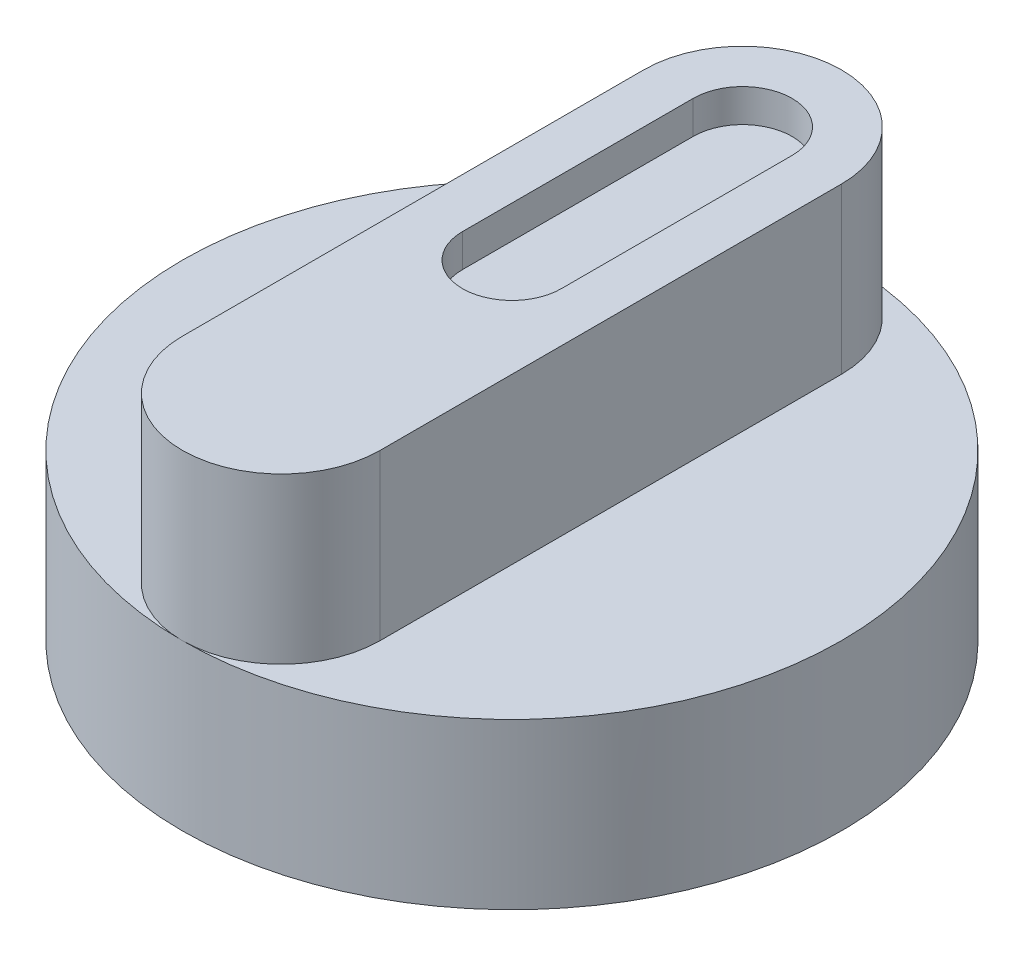
ISO-10303-21;
HEADER;
FILE_DESCRIPTION(('STEP AP214'),'2;1');
FILE_NAME('part.step','',(''),(''),'','','');
FILE_SCHEMA(('AUTOMOTIVE_DESIGN { 1 0 10303 214 1 1 1 1 }'));
ENDSEC;
DATA;
#1=APPLICATION_CONTEXT('core data for automotive mechanical design processes');
#2=APPLICATION_PROTOCOL_DEFINITION('international standard','automotive_design',2000,#1);
#3=PRODUCT_CONTEXT('',#1,'mechanical');
#4=PRODUCT('Part','Part','',(#3));
#5=PRODUCT_RELATED_PRODUCT_CATEGORY('part','',(#4));
#6=PRODUCT_DEFINITION_FORMATION('','',#4);
#7=PRODUCT_DEFINITION_CONTEXT('part definition',#1,'design');
#8=PRODUCT_DEFINITION('design','',#6,#7);
#9=PRODUCT_DEFINITION_SHAPE('','',#8);
#10=(LENGTH_UNIT() NAMED_UNIT(*) SI_UNIT(.MILLI.,.METRE.));
#11=(NAMED_UNIT(*) PLANE_ANGLE_UNIT() SI_UNIT($,.RADIAN.));
#12=(NAMED_UNIT(*) SI_UNIT($,.STERADIAN.) SOLID_ANGLE_UNIT());
#13=UNCERTAINTY_MEASURE_WITH_UNIT(LENGTH_MEASURE(1.E-05),#10,'distance_accuracy_value','');
#14=(GEOMETRIC_REPRESENTATION_CONTEXT(3) GLOBAL_UNCERTAINTY_ASSIGNED_CONTEXT((#13)) GLOBAL_UNIT_ASSIGNED_CONTEXT((#10,
#11,#12)) REPRESENTATION_CONTEXT('',''));
#15=CARTESIAN_POINT('',(0.,0.,0.));
#16=DIRECTION('',(0.,0.,1.));
#17=DIRECTION('',(1.,0.,0.));
#18=AXIS2_PLACEMENT_3D('',#15,#16,#17);
#19=CARTESIAN_POINT('',(0.,10.,0.));
#20=DIRECTION('',(0.,1.,0.));
#21=DIRECTION('',(0.,0.,1.));
#22=AXIS2_PLACEMENT_3D('',#19,#20,#21);
#23=PLANE('',#22);
#24=DIRECTION('',(0.,0.,-1.));
#25=VECTOR('',#24,1.);
#26=CARTESIAN_POINT('',(6.,10.,-14.));
#27=LINE('',#26,#25);
#28=CARTESIAN_POINT('',(6.,10.,14.));
#29=VERTEX_POINT('',#28);
#30=CARTESIAN_POINT('',(6.,10.,-14.));
#31=VERTEX_POINT('',#30);
#32=EDGE_CURVE('E61',#29,#31,#27,.T.);
#33=ORIENTED_EDGE('',*,*,#32,.F.);
#34=CARTESIAN_POINT('',(0.,10.,14.));
#35=DIRECTION('',(0.,1.,0.));
#36=DIRECTION('',(0.,0.,1.));
#37=AXIS2_PLACEMENT_3D('',#34,#35,#36);
#38=CIRCLE('',#37,6.);
#39=CARTESIAN_POINT('',(0.,10.,20.));
#40=VERTEX_POINT('',#39);
#41=EDGE_CURVE('E11',#40,#29,#38,.T.);
#42=ORIENTED_EDGE('',*,*,#41,.F.);
#43=CARTESIAN_POINT('',(0.,10.,0.));
#44=DIRECTION('',(0.,1.,0.));
#45=DIRECTION('',(0.,0.,1.));
#46=AXIS2_PLACEMENT_3D('',#43,#44,#45);
#47=CIRCLE('',#46,20.);
#48=CARTESIAN_POINT('',(0.,10.,-20.));
#49=VERTEX_POINT('',#48);
#50=EDGE_CURVE('E174',#40,#49,#47,.T.);
#51=ORIENTED_EDGE('',*,*,#50,.T.);
#52=CARTESIAN_POINT('',(0.,10.,-14.));
#53=DIRECTION('',(0.,1.,0.));
#54=DIRECTION('',(0.,0.,1.));
#55=AXIS2_PLACEMENT_3D('',#52,#53,#54);
#56=CIRCLE('',#55,6.);
#57=EDGE_CURVE('E143',#31,#49,#56,.T.);
#58=ORIENTED_EDGE('',*,*,#57,.F.);
#59=EDGE_LOOP('',(#33,#42,#51,#58));
#60=FACE_BOUND('',#59,.T.);
#61=ADVANCED_FACE('F35',(#60),#23,.T.);
#62=CARTESIAN_POINT('',(0.,10.,0.));
#63=DIRECTION('',(0.,-1.,0.));
#64=DIRECTION('',(0.,0.,-1.));
#65=AXIS2_PLACEMENT_3D('',#62,#63,#64);
#66=CYLINDRICAL_SURFACE('',#65,20.);
#67=ORIENTED_EDGE('',*,*,#50,.F.);
#68=EDGE_CURVE('E176',#49,#40,#47,.T.);
#69=ORIENTED_EDGE('',*,*,#68,.F.);
#70=EDGE_LOOP('',(#67,#69));
#71=FACE_BOUND('',#70,.T.);
#72=CARTESIAN_POINT('',(0.,0.,0.));
#73=DIRECTION('',(0.,1.,0.));
#74=DIRECTION('',(0.,0.,1.));
#75=AXIS2_PLACEMENT_3D('',#72,#73,#74);
#76=CIRCLE('',#75,20.);
#77=CARTESIAN_POINT('',(0.,0.,20.));
#78=VERTEX_POINT('',#77);
#79=EDGE_CURVE('E39',#78,#78,#76,.T.);
#80=ORIENTED_EDGE('',*,*,#79,.T.);
#81=EDGE_LOOP('',(#80));
#82=FACE_BOUND('',#81,.T.);
#83=ADVANCED_FACE('F37',(#71,#82),#66,.T.);
#84=CARTESIAN_POINT('',(-6.00000000000001,10.,-14.));
#85=VERTEX_POINT('',#84);
#86=EDGE_CURVE('E44',#49,#85,#56,.T.);
#87=ORIENTED_EDGE('',*,*,#86,.F.);
#88=ORIENTED_EDGE('',*,*,#68,.T.);
#89=CARTESIAN_POINT('',(-6.,10.,14.));
#90=VERTEX_POINT('',#89);
#91=EDGE_CURVE('E46',#90,#40,#38,.T.);
#92=ORIENTED_EDGE('',*,*,#91,.F.);
#93=DIRECTION('',(0.,0.,1.));
#94=VECTOR('',#93,1.);
#95=CARTESIAN_POINT('',(-6.00000000000001,10.,-14.));
#96=LINE('',#95,#94);
#97=EDGE_CURVE('E159',#85,#90,#96,.T.);
#98=ORIENTED_EDGE('',*,*,#97,.F.);
#99=EDGE_LOOP('',(#87,#88,#92,#98));
#100=FACE_BOUND('',#99,.T.);
#101=ADVANCED_FACE('F189',(#100),#23,.T.);
#102=CARTESIAN_POINT('',(0.,0.,0.));
#103=DIRECTION('',(0.,1.,0.));
#104=DIRECTION('',(0.,0.,1.));
#105=AXIS2_PLACEMENT_3D('',#102,#103,#104);
#106=PLANE('',#105);
#107=ORIENTED_EDGE('',*,*,#79,.F.);
#108=EDGE_LOOP('',(#107));
#109=FACE_BOUND('',#108,.T.);
#110=ADVANCED_FACE('F186',(#109),#106,.F.);
#111=CARTESIAN_POINT('',(0.,20.,-14.));
#112=DIRECTION('',(0.,-1.,0.));
#113=DIRECTION('',(0.,0.,-1.));
#114=AXIS2_PLACEMENT_3D('',#111,#112,#113);
#115=CYLINDRICAL_SURFACE('',#114,6.);
#116=ORIENTED_EDGE('',*,*,#57,.T.);
#117=ORIENTED_EDGE('',*,*,#86,.T.);
#118=DIRECTION('',(0.,-1.,0.));
#119=VECTOR('',#118,1.);
#120=CARTESIAN_POINT('',(-6.00000000000001,20.,-14.));
#121=LINE('',#120,#119);
#122=CARTESIAN_POINT('',(-6.00000000000001,20.,-14.));
#123=VERTEX_POINT('',#122);
#124=EDGE_CURVE('E172',#123,#85,#121,.T.);
#125=ORIENTED_EDGE('',*,*,#124,.F.);
#126=CARTESIAN_POINT('',(0.,20.,-14.));
#127=DIRECTION('',(0.,1.,0.));
#128=DIRECTION('',(0.,0.,1.));
#129=AXIS2_PLACEMENT_3D('',#126,#127,#128);
#130=CIRCLE('',#129,6.);
#131=CARTESIAN_POINT('',(6.,20.,-14.));
#132=VERTEX_POINT('',#131);
#133=EDGE_CURVE('E147',#132,#123,#130,.T.);
#134=ORIENTED_EDGE('',*,*,#133,.F.);
#135=DIRECTION('',(0.,-1.,0.));
#136=VECTOR('',#135,1.);
#137=CARTESIAN_POINT('',(6.,20.,-14.));
#138=LINE('',#137,#136);
#139=EDGE_CURVE('E156',#132,#31,#138,.T.);
#140=ORIENTED_EDGE('',*,*,#139,.T.);
#141=EDGE_LOOP('',(#116,#117,#125,#134,#140));
#142=FACE_BOUND('',#141,.T.);
#143=ADVANCED_FACE('F188',(#142),#115,.T.);
#144=CARTESIAN_POINT('',(-6.00000000000001,20.,-14.));
#145=DIRECTION('',(1.,0.,0.));
#146=DIRECTION('',(0.,0.,-1.));
#147=AXIS2_PLACEMENT_3D('',#144,#145,#146);
#148=PLANE('',#147);
#149=ORIENTED_EDGE('',*,*,#97,.T.);
#150=DIRECTION('',(0.,-1.,0.));
#151=VECTOR('',#150,1.);
#152=CARTESIAN_POINT('',(-6.,20.,14.));
#153=LINE('',#152,#151);
#154=CARTESIAN_POINT('',(-6.,20.,14.));
#155=VERTEX_POINT('',#154);
#156=EDGE_CURVE('E169',#155,#90,#153,.T.);
#157=ORIENTED_EDGE('',*,*,#156,.F.);
#158=DIRECTION('',(0.,0.,1.));
#159=VECTOR('',#158,1.);
#160=CARTESIAN_POINT('',(-6.00000000000001,20.,-14.));
#161=LINE('',#160,#159);
#162=EDGE_CURVE('E150',#123,#155,#161,.T.);
#163=ORIENTED_EDGE('',*,*,#162,.F.);
#164=ORIENTED_EDGE('',*,*,#124,.T.);
#165=EDGE_LOOP('',(#149,#157,#163,#164));
#166=FACE_BOUND('',#165,.T.);
#167=ADVANCED_FACE('F194',(#166),#148,.F.);
#168=CARTESIAN_POINT('',(0.,20.,14.));
#169=DIRECTION('',(0.,-1.,0.));
#170=DIRECTION('',(0.,0.,-1.));
#171=AXIS2_PLACEMENT_3D('',#168,#169,#170);
#172=CYLINDRICAL_SURFACE('',#171,6.);
#173=ORIENTED_EDGE('',*,*,#91,.T.);
#174=ORIENTED_EDGE('',*,*,#41,.T.);
#175=DIRECTION('',(0.,-1.,0.));
#176=VECTOR('',#175,1.);
#177=CARTESIAN_POINT('',(6.,20.,14.));
#178=LINE('',#177,#176);
#179=CARTESIAN_POINT('',(6.,20.,14.));
#180=VERTEX_POINT('',#179);
#181=EDGE_CURVE('E166',#180,#29,#178,.T.);
#182=ORIENTED_EDGE('',*,*,#181,.F.);
#183=CARTESIAN_POINT('',(0.,20.,14.));
#184=DIRECTION('',(0.,1.,0.));
#185=DIRECTION('',(0.,0.,1.));
#186=AXIS2_PLACEMENT_3D('',#183,#184,#185);
#187=CIRCLE('',#186,6.);
#188=EDGE_CURVE('E152',#155,#180,#187,.T.);
#189=ORIENTED_EDGE('',*,*,#188,.F.);
#190=ORIENTED_EDGE('',*,*,#156,.T.);
#191=EDGE_LOOP('',(#173,#174,#182,#189,#190));
#192=FACE_BOUND('',#191,.T.);
#193=ADVANCED_FACE('F206',(#192),#172,.T.);
#194=CARTESIAN_POINT('',(6.,20.,-14.));
#195=DIRECTION('',(-1.,0.,0.));
#196=DIRECTION('',(0.,0.,1.));
#197=AXIS2_PLACEMENT_3D('',#194,#195,#196);
#198=PLANE('',#197);
#199=ORIENTED_EDGE('',*,*,#32,.T.);
#200=ORIENTED_EDGE('',*,*,#139,.F.);
#201=DIRECTION('',(0.,0.,-1.));
#202=VECTOR('',#201,1.);
#203=CARTESIAN_POINT('',(6.,20.,-14.));
#204=LINE('',#203,#202);
#205=EDGE_CURVE('E154',#180,#132,#204,.T.);
#206=ORIENTED_EDGE('',*,*,#205,.F.);
#207=ORIENTED_EDGE('',*,*,#181,.T.);
#208=EDGE_LOOP('',(#199,#200,#206,#207));
#209=FACE_BOUND('',#208,.T.);
#210=ADVANCED_FACE('F210',(#209),#198,.F.);
#211=CARTESIAN_POINT('',(0.,20.,-14.));
#212=DIRECTION('',(0.,1.,0.));
#213=DIRECTION('',(0.,0.,1.));
#214=AXIS2_PLACEMENT_3D('',#211,#212,#213);
#215=PLANE('',#214);
#216=CARTESIAN_POINT('',(0.,20.,-14.));
#217=DIRECTION('',(0.,1.,0.));
#218=DIRECTION('',(0.,0.,1.));
#219=AXIS2_PLACEMENT_3D('',#216,#217,#218);
#220=CIRCLE('',#219,2.99999999999999);
#221=CARTESIAN_POINT('',(2.99999999999999,20.,-14.));
#222=VERTEX_POINT('',#221);
#223=CARTESIAN_POINT('',(-2.99999999999999,20.,-14.));
#224=VERTEX_POINT('',#223);
#225=EDGE_CURVE('E53',#222,#224,#220,.T.);
#226=ORIENTED_EDGE('',*,*,#225,.F.);
#227=DIRECTION('',(0.,0.,-1.));
#228=VECTOR('',#227,1.);
#229=CARTESIAN_POINT('',(2.99999999999999,20.,-14.));
#230=LINE('',#229,#228);
#231=CARTESIAN_POINT('',(3.,20.,0.));
#232=VERTEX_POINT('',#231);
#233=EDGE_CURVE('E128',#232,#222,#230,.T.);
#234=ORIENTED_EDGE('',*,*,#233,.F.);
#235=CARTESIAN_POINT('',(0.,20.,0.));
#236=DIRECTION('',(0.,1.,0.));
#237=DIRECTION('',(0.,0.,1.));
#238=AXIS2_PLACEMENT_3D('',#235,#236,#237);
#239=CIRCLE('',#238,2.99999999999999);
#240=CARTESIAN_POINT('',(-2.99999999999999,20.,0.));
#241=VERTEX_POINT('',#240);
#242=EDGE_CURVE('E131',#241,#232,#239,.T.);
#243=ORIENTED_EDGE('',*,*,#242,.F.);
#244=DIRECTION('',(0.,0.,1.));
#245=VECTOR('',#244,1.);
#246=CARTESIAN_POINT('',(-2.99999999999999,20.,-14.));
#247=LINE('',#246,#245);
#248=EDGE_CURVE('E137',#224,#241,#247,.T.);
#249=ORIENTED_EDGE('',*,*,#248,.F.);
#250=EDGE_LOOP('',(#226,#234,#243,#249));
#251=FACE_BOUND('',#250,.T.);
#252=ORIENTED_EDGE('',*,*,#133,.T.);
#253=ORIENTED_EDGE('',*,*,#162,.T.);
#254=ORIENTED_EDGE('',*,*,#188,.T.);
#255=ORIENTED_EDGE('',*,*,#205,.T.);
#256=EDGE_LOOP('',(#252,#253,#254,#255));
#257=FACE_BOUND('',#256,.T.);
#258=ADVANCED_FACE('F214',(#251,#257),#215,.T.);
#259=CARTESIAN_POINT('',(0.,18.,-14.));
#260=DIRECTION('',(0.,1.,0.));
#261=DIRECTION('',(0.,0.,1.));
#262=AXIS2_PLACEMENT_3D('',#259,#260,#261);
#263=CYLINDRICAL_SURFACE('',#262,2.99999999999999);
#264=ORIENTED_EDGE('',*,*,#225,.T.);
#265=DIRECTION('',(0.,1.,0.));
#266=VECTOR('',#265,1.);
#267=CARTESIAN_POINT('',(-2.99999999999999,18.,-14.));
#268=LINE('',#267,#266);
#269=CARTESIAN_POINT('',(-2.99999999999999,18.,-14.));
#270=VERTEX_POINT('',#269);
#271=EDGE_CURVE('E106',#270,#224,#268,.T.);
#272=ORIENTED_EDGE('',*,*,#271,.F.);
#273=CARTESIAN_POINT('',(0.,18.,-14.));
#274=DIRECTION('',(0.,1.,0.));
#275=DIRECTION('',(0.,0.,1.));
#276=AXIS2_PLACEMENT_3D('',#273,#274,#275);
#277=CIRCLE('',#276,2.99999999999999);
#278=CARTESIAN_POINT('',(2.99999999999999,18.,-14.));
#279=VERTEX_POINT('',#278);
#280=EDGE_CURVE('E110',#279,#270,#277,.T.);
#281=ORIENTED_EDGE('',*,*,#280,.F.);
#282=DIRECTION('',(0.,1.,0.));
#283=VECTOR('',#282,1.);
#284=CARTESIAN_POINT('',(2.99999999999999,18.,-14.));
#285=LINE('',#284,#283);
#286=EDGE_CURVE('E141',#279,#222,#285,.T.);
#287=ORIENTED_EDGE('',*,*,#286,.T.);
#288=EDGE_LOOP('',(#264,#272,#281,#287));
#289=FACE_BOUND('',#288,.T.);
#290=ADVANCED_FACE('F108',(#289),#263,.F.);
#291=CARTESIAN_POINT('',(2.99999999999999,18.,-14.));
#292=DIRECTION('',(1.,0.,0.));
#293=DIRECTION('',(0.,0.,-1.));
#294=AXIS2_PLACEMENT_3D('',#291,#292,#293);
#295=PLANE('',#294);
#296=ORIENTED_EDGE('',*,*,#233,.T.);
#297=ORIENTED_EDGE('',*,*,#286,.F.);
#298=DIRECTION('',(0.,0.,-1.));
#299=VECTOR('',#298,1.);
#300=CARTESIAN_POINT('',(2.99999999999999,18.,-14.));
#301=LINE('',#300,#299);
#302=CARTESIAN_POINT('',(3.,18.,0.));
#303=VERTEX_POINT('',#302);
#304=EDGE_CURVE('E116',#303,#279,#301,.T.);
#305=ORIENTED_EDGE('',*,*,#304,.F.);
#306=DIRECTION('',(0.,1.,0.));
#307=VECTOR('',#306,1.);
#308=CARTESIAN_POINT('',(3.,18.,0.));
#309=LINE('',#308,#307);
#310=EDGE_CURVE('E144',#303,#232,#309,.T.);
#311=ORIENTED_EDGE('',*,*,#310,.T.);
#312=EDGE_LOOP('',(#296,#297,#305,#311));
#313=FACE_BOUND('',#312,.T.);
#314=ADVANCED_FACE('F221',(#313),#295,.F.);
#315=CARTESIAN_POINT('',(0.,18.,0.));
#316=DIRECTION('',(0.,1.,0.));
#317=DIRECTION('',(0.,0.,1.));
#318=AXIS2_PLACEMENT_3D('',#315,#316,#317);
#319=CYLINDRICAL_SURFACE('',#318,2.99999999999999);
#320=ORIENTED_EDGE('',*,*,#242,.T.);
#321=ORIENTED_EDGE('',*,*,#310,.F.);
#322=CARTESIAN_POINT('',(0.,18.,0.));
#323=DIRECTION('',(0.,1.,0.));
#324=DIRECTION('',(0.,0.,1.));
#325=AXIS2_PLACEMENT_3D('',#322,#323,#324);
#326=CIRCLE('',#325,2.99999999999999);
#327=CARTESIAN_POINT('',(-2.99999999999999,18.,0.));
#328=VERTEX_POINT('',#327);
#329=EDGE_CURVE('E124',#328,#303,#326,.T.);
#330=ORIENTED_EDGE('',*,*,#329,.F.);
#331=DIRECTION('',(0.,1.,0.));
#332=VECTOR('',#331,1.);
#333=CARTESIAN_POINT('',(-2.99999999999999,18.,0.));
#334=LINE('',#333,#332);
#335=EDGE_CURVE('E115',#328,#241,#334,.T.);
#336=ORIENTED_EDGE('',*,*,#335,.T.);
#337=EDGE_LOOP('',(#320,#321,#330,#336));
#338=FACE_BOUND('',#337,.T.);
#339=ADVANCED_FACE('F224',(#338),#319,.F.);
#340=CARTESIAN_POINT('',(-2.99999999999999,18.,-14.));
#341=DIRECTION('',(-1.,0.,0.));
#342=DIRECTION('',(0.,0.,1.));
#343=AXIS2_PLACEMENT_3D('',#340,#341,#342);
#344=PLANE('',#343);
#345=ORIENTED_EDGE('',*,*,#248,.T.);
#346=ORIENTED_EDGE('',*,*,#335,.F.);
#347=DIRECTION('',(0.,0.,1.));
#348=VECTOR('',#347,1.);
#349=CARTESIAN_POINT('',(-2.99999999999999,18.,-14.));
#350=LINE('',#349,#348);
#351=EDGE_CURVE('E119',#270,#328,#350,.T.);
#352=ORIENTED_EDGE('',*,*,#351,.F.);
#353=ORIENTED_EDGE('',*,*,#271,.T.);
#354=EDGE_LOOP('',(#345,#346,#352,#353));
#355=FACE_BOUND('',#354,.T.);
#356=ADVANCED_FACE('F120',(#355),#344,.F.);
#357=CARTESIAN_POINT('',(0.,18.,-14.));
#358=DIRECTION('',(0.,1.,0.));
#359=DIRECTION('',(0.,0.,1.));
#360=AXIS2_PLACEMENT_3D('',#357,#358,#359);
#361=PLANE('',#360);
#362=ORIENTED_EDGE('',*,*,#280,.T.);
#363=ORIENTED_EDGE('',*,*,#351,.T.);
#364=ORIENTED_EDGE('',*,*,#329,.T.);
#365=ORIENTED_EDGE('',*,*,#304,.T.);
#366=EDGE_LOOP('',(#362,#363,#364,#365));
#367=FACE_BOUND('',#366,.T.);
#368=ADVANCED_FACE('F126',(#367),#361,.T.);
#369=CLOSED_SHELL('',(#61,#83,#101,#110,#143,#167,#193,#210,#258,#290,#314,#339,#356,#368));
#370=MANIFOLD_SOLID_BREP('B2',#369);
#371=ADVANCED_BREP_SHAPE_REPRESENTATION('',(#18,#370),#14);
#372=SHAPE_DEFINITION_REPRESENTATION(#9,#371);
ENDSEC;
END-ISO-10303-21;
